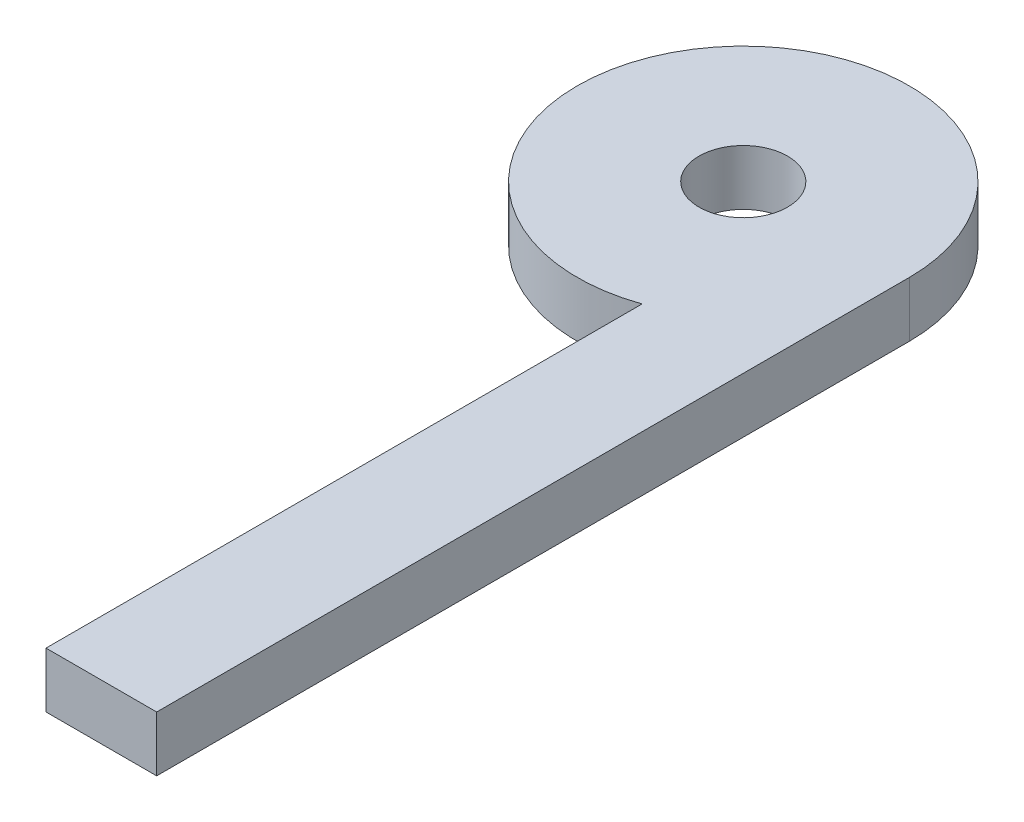
ISO-10303-21;
HEADER;
FILE_DESCRIPTION(('STEP AP214'),'2;1');
FILE_NAME('part.step','',(''),(''),'','','');
FILE_SCHEMA(('AUTOMOTIVE_DESIGN { 1 0 10303 214 1 1 1 1 }'));
ENDSEC;
DATA;
#1=APPLICATION_CONTEXT('core data for automotive mechanical design processes');
#2=APPLICATION_PROTOCOL_DEFINITION('international standard','automotive_design',2000,#1);
#3=PRODUCT_CONTEXT('',#1,'mechanical');
#4=PRODUCT('Part','Part','',(#3));
#5=PRODUCT_RELATED_PRODUCT_CATEGORY('part','',(#4));
#6=PRODUCT_DEFINITION_FORMATION('','',#4);
#7=PRODUCT_DEFINITION_CONTEXT('part definition',#1,'design');
#8=PRODUCT_DEFINITION('design','',#6,#7);
#9=PRODUCT_DEFINITION_SHAPE('','',#8);
#10=(LENGTH_UNIT() NAMED_UNIT(*) SI_UNIT(.MILLI.,.METRE.));
#11=(NAMED_UNIT(*) PLANE_ANGLE_UNIT() SI_UNIT($,.RADIAN.));
#12=(NAMED_UNIT(*) SI_UNIT($,.STERADIAN.) SOLID_ANGLE_UNIT());
#13=UNCERTAINTY_MEASURE_WITH_UNIT(LENGTH_MEASURE(1.E-05),#10,'distance_accuracy_value','');
#14=(GEOMETRIC_REPRESENTATION_CONTEXT(3) GLOBAL_UNCERTAINTY_ASSIGNED_CONTEXT((#13)) GLOBAL_UNIT_ASSIGNED_CONTEXT((#10,
#11,#12)) REPRESENTATION_CONTEXT('',''));
#15=CARTESIAN_POINT('',(0.,0.,0.));
#16=DIRECTION('',(0.,0.,1.));
#17=DIRECTION('',(1.,0.,0.));
#18=AXIS2_PLACEMENT_3D('',#15,#16,#17);
#19=CARTESIAN_POINT('',(0.,6.35,0.));
#20=DIRECTION('',(0.,-1.,0.));
#21=DIRECTION('',(0.,0.,-1.));
#22=AXIS2_PLACEMENT_3D('',#19,#20,#21);
#23=CYLINDRICAL_SURFACE('',#22,19.05);
#24=CARTESIAN_POINT('',(0.,6.35,0.));
#25=DIRECTION('',(0.,1.,0.));
#26=DIRECTION('',(0.,0.,1.));
#27=AXIS2_PLACEMENT_3D('',#24,#25,#26);
#28=CIRCLE('',#27,19.05);
#29=CARTESIAN_POINT('',(19.05,6.35,0.));
#30=VERTEX_POINT('',#29);
#31=CARTESIAN_POINT('',(6.35,6.35,17.9605122421383));
#32=VERTEX_POINT('',#31);
#33=EDGE_CURVE('E12',#30,#32,#28,.T.);
#34=ORIENTED_EDGE('',*,*,#33,.F.);
#35=DIRECTION('',(0.,-1.,0.));
#36=VECTOR('',#35,1.);
#37=CARTESIAN_POINT('',(19.05,6.35,0.));
#38=LINE('',#37,#36);
#39=CARTESIAN_POINT('',(19.05,0.,0.));
#40=VERTEX_POINT('',#39);
#41=EDGE_CURVE('E97',#30,#40,#38,.T.);
#42=ORIENTED_EDGE('',*,*,#41,.T.);
#43=CARTESIAN_POINT('',(0.,0.,0.));
#44=DIRECTION('',(0.,1.,0.));
#45=DIRECTION('',(0.,0.,1.));
#46=AXIS2_PLACEMENT_3D('',#43,#44,#45);
#47=CIRCLE('',#46,19.05);
#48=CARTESIAN_POINT('',(6.35,0.,17.9605122421383));
#49=VERTEX_POINT('',#48);
#50=EDGE_CURVE('E41',#40,#49,#47,.T.);
#51=ORIENTED_EDGE('',*,*,#50,.T.);
#52=DIRECTION('',(0.,-1.,0.));
#53=VECTOR('',#52,1.);
#54=CARTESIAN_POINT('',(6.35,6.35,17.9605122421383));
#55=LINE('',#54,#53);
#56=EDGE_CURVE('E56',#49,#32,#55,.F.);
#57=ORIENTED_EDGE('',*,*,#56,.T.);
#58=EDGE_LOOP('',(#34,#42,#51,#57));
#59=FACE_BOUND('',#58,.T.);
#60=ADVANCED_FACE('F38',(#59),#23,.T.);
#61=CARTESIAN_POINT('',(0.,6.35,0.));
#62=DIRECTION('',(0.,1.,0.));
#63=DIRECTION('',(0.,0.,1.));
#64=AXIS2_PLACEMENT_3D('',#61,#62,#63);
#65=PLANE('',#64);
#66=CARTESIAN_POINT('',(0.,6.35,0.));
#67=DIRECTION('',(0.,-1.,0.));
#68=DIRECTION('',(0.,0.,-1.));
#69=AXIS2_PLACEMENT_3D('',#66,#67,#68);
#70=CIRCLE('',#69,5.08);
#71=CARTESIAN_POINT('',(0.,6.35,-5.08));
#72=VERTEX_POINT('',#71);
#73=EDGE_CURVE('E112',#72,#72,#70,.T.);
#74=ORIENTED_EDGE('',*,*,#73,.T.);
#75=EDGE_LOOP('',(#74));
#76=FACE_BOUND('',#75,.T.);
#77=ORIENTED_EDGE('',*,*,#33,.T.);
#78=DIRECTION('',(0.,0.,-1.));
#79=VECTOR('',#78,1.);
#80=CARTESIAN_POINT('',(6.35,6.35,0.));
#81=LINE('',#80,#79);
#82=CARTESIAN_POINT('',(6.35,6.35,86.36));
#83=VERTEX_POINT('',#82);
#84=EDGE_CURVE('E87',#83,#32,#81,.T.);
#85=ORIENTED_EDGE('',*,*,#84,.F.);
#86=DIRECTION('',(-1.,0.,0.));
#87=VECTOR('',#86,1.);
#88=CARTESIAN_POINT('',(19.05,6.35,86.36));
#89=LINE('',#88,#87);
#90=CARTESIAN_POINT('',(19.05,6.35,86.36));
#91=VERTEX_POINT('',#90);
#92=EDGE_CURVE('E79',#91,#83,#89,.T.);
#93=ORIENTED_EDGE('',*,*,#92,.F.);
#94=DIRECTION('',(0.,0.,1.));
#95=VECTOR('',#94,1.);
#96=CARTESIAN_POINT('',(19.05,6.35,0.));
#97=LINE('',#96,#95);
#98=EDGE_CURVE('E93',#30,#91,#97,.T.);
#99=ORIENTED_EDGE('',*,*,#98,.F.);
#100=EDGE_LOOP('',(#77,#85,#93,#99));
#101=FACE_BOUND('',#100,.T.);
#102=ADVANCED_FACE('F92',(#76,#101),#65,.T.);
#103=CARTESIAN_POINT('',(0.,0.,0.));
#104=DIRECTION('',(0.,1.,0.));
#105=DIRECTION('',(0.,0.,1.));
#106=AXIS2_PLACEMENT_3D('',#103,#104,#105);
#107=PLANE('',#106);
#108=CARTESIAN_POINT('',(0.,0.,0.));
#109=DIRECTION('',(0.,-1.,0.));
#110=DIRECTION('',(0.,0.,-1.));
#111=AXIS2_PLACEMENT_3D('',#108,#109,#110);
#112=CIRCLE('',#111,5.08);
#113=CARTESIAN_POINT('',(0.,0.,-5.08));
#114=VERTEX_POINT('',#113);
#115=EDGE_CURVE('E103',#114,#114,#112,.T.);
#116=ORIENTED_EDGE('',*,*,#115,.F.);
#117=EDGE_LOOP('',(#116));
#118=FACE_BOUND('',#117,.T.);
#119=ORIENTED_EDGE('',*,*,#50,.F.);
#120=DIRECTION('',(0.,0.,1.));
#121=VECTOR('',#120,1.);
#122=CARTESIAN_POINT('',(19.05,0.,0.));
#123=LINE('',#122,#121);
#124=CARTESIAN_POINT('',(19.05,0.,86.36));
#125=VERTEX_POINT('',#124);
#126=EDGE_CURVE('E108',#40,#125,#123,.T.);
#127=ORIENTED_EDGE('',*,*,#126,.T.);
#128=DIRECTION('',(-1.,0.,0.));
#129=VECTOR('',#128,1.);
#130=CARTESIAN_POINT('',(19.05,0.,86.36));
#131=LINE('',#130,#129);
#132=CARTESIAN_POINT('',(6.35,0.,86.36));
#133=VERTEX_POINT('',#132);
#134=EDGE_CURVE('E81',#125,#133,#131,.T.);
#135=ORIENTED_EDGE('',*,*,#134,.T.);
#136=DIRECTION('',(0.,0.,-1.));
#137=VECTOR('',#136,1.);
#138=CARTESIAN_POINT('',(6.35,0.,0.));
#139=LINE('',#138,#137);
#140=EDGE_CURVE('E98',#133,#49,#139,.T.);
#141=ORIENTED_EDGE('',*,*,#140,.T.);
#142=EDGE_LOOP('',(#119,#127,#135,#141));
#143=FACE_BOUND('',#142,.T.);
#144=ADVANCED_FACE('F128',(#118,#143),#107,.F.);
#145=CARTESIAN_POINT('',(6.35,6.35,0.));
#146=DIRECTION('',(-1.,0.,0.));
#147=DIRECTION('',(0.,0.,1.));
#148=AXIS2_PLACEMENT_3D('',#145,#146,#147);
#149=PLANE('',#148);
#150=ORIENTED_EDGE('',*,*,#56,.F.);
#151=ORIENTED_EDGE('',*,*,#140,.F.);
#152=DIRECTION('',(0.,-1.,0.));
#153=VECTOR('',#152,1.);
#154=CARTESIAN_POINT('',(6.35,6.35,86.36));
#155=LINE('',#154,#153);
#156=EDGE_CURVE('E86',#83,#133,#155,.T.);
#157=ORIENTED_EDGE('',*,*,#156,.F.);
#158=ORIENTED_EDGE('',*,*,#84,.T.);
#159=EDGE_LOOP('',(#150,#151,#157,#158));
#160=FACE_BOUND('',#159,.T.);
#161=ADVANCED_FACE('F127',(#160),#149,.T.);
#162=CARTESIAN_POINT('',(19.05,6.35,0.));
#163=DIRECTION('',(1.,0.,0.));
#164=DIRECTION('',(0.,0.,-1.));
#165=AXIS2_PLACEMENT_3D('',#162,#163,#164);
#166=PLANE('',#165);
#167=ORIENTED_EDGE('',*,*,#126,.F.);
#168=ORIENTED_EDGE('',*,*,#41,.F.);
#169=ORIENTED_EDGE('',*,*,#98,.T.);
#170=DIRECTION('',(0.,-1.,0.));
#171=VECTOR('',#170,1.);
#172=CARTESIAN_POINT('',(19.05,6.35,86.36));
#173=LINE('',#172,#171);
#174=EDGE_CURVE('E76',#91,#125,#173,.T.);
#175=ORIENTED_EDGE('',*,*,#174,.T.);
#176=EDGE_LOOP('',(#167,#168,#169,#175));
#177=FACE_BOUND('',#176,.T.);
#178=ADVANCED_FACE('F96',(#177),#166,.T.);
#179=CARTESIAN_POINT('',(19.05,6.35,86.36));
#180=DIRECTION('',(0.,0.,1.));
#181=DIRECTION('',(1.,0.,0.));
#182=AXIS2_PLACEMENT_3D('',#179,#180,#181);
#183=PLANE('',#182);
#184=ORIENTED_EDGE('',*,*,#134,.F.);
#185=ORIENTED_EDGE('',*,*,#174,.F.);
#186=ORIENTED_EDGE('',*,*,#92,.T.);
#187=ORIENTED_EDGE('',*,*,#156,.T.);
#188=EDGE_LOOP('',(#184,#185,#186,#187));
#189=FACE_BOUND('',#188,.T.);
#190=ADVANCED_FACE('F78',(#189),#183,.T.);
#191=CARTESIAN_POINT('',(0.,6.35,0.));
#192=DIRECTION('',(0.,-1.,0.));
#193=DIRECTION('',(0.,0.,-1.));
#194=AXIS2_PLACEMENT_3D('',#191,#192,#193);
#195=CYLINDRICAL_SURFACE('',#194,5.08);
#196=ORIENTED_EDGE('',*,*,#73,.F.);
#197=EDGE_LOOP('',(#196));
#198=FACE_BOUND('',#197,.T.);
#199=ORIENTED_EDGE('',*,*,#115,.T.);
#200=EDGE_LOOP('',(#199));
#201=FACE_BOUND('',#200,.T.);
#202=ADVANCED_FACE('F164',(#198,#201),#195,.F.);
#203=CLOSED_SHELL('',(#60,#102,#144,#161,#178,#190,#202));
#204=MANIFOLD_SOLID_BREP('B2',#203);
#205=ADVANCED_BREP_SHAPE_REPRESENTATION('',(#18,#204),#14);
#206=SHAPE_DEFINITION_REPRESENTATION(#9,#205);
ENDSEC;
END-ISO-10303-21;
